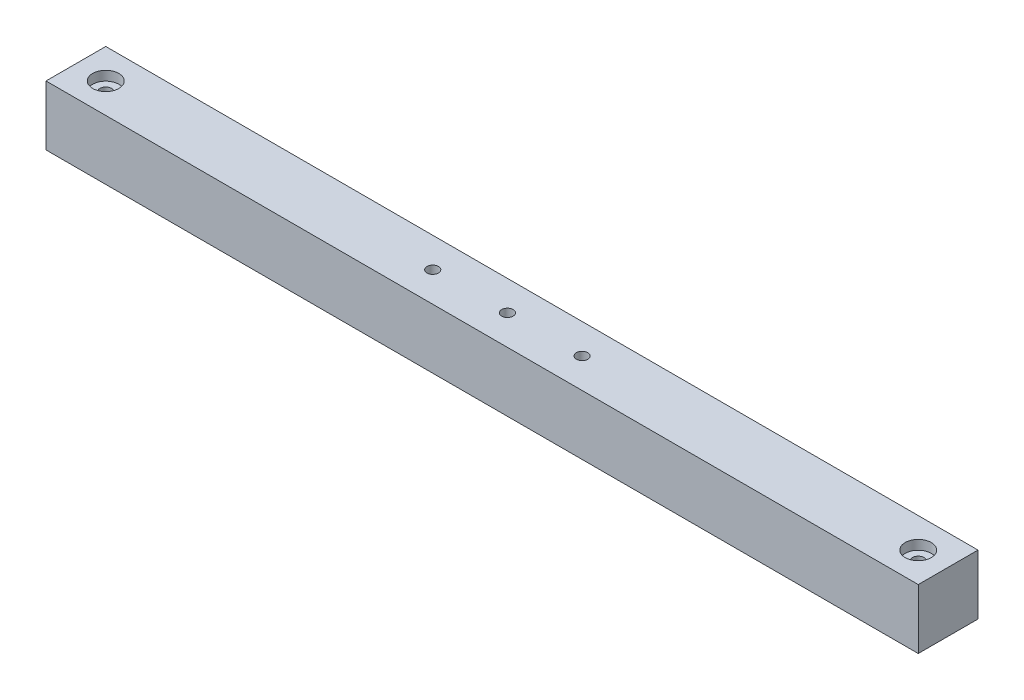
ISO-10303-21;
HEADER;
FILE_DESCRIPTION(('STEP AP214'),'2;1');
FILE_NAME('part.step','',(''),(''),'','','');
FILE_SCHEMA(('AUTOMOTIVE_DESIGN { 1 0 10303 214 1 1 1 1 }'));
ENDSEC;
DATA;
#1=APPLICATION_CONTEXT('core data for automotive mechanical design processes');
#2=APPLICATION_PROTOCOL_DEFINITION('international standard','automotive_design',2000,#1);
#3=PRODUCT_CONTEXT('',#1,'mechanical');
#4=PRODUCT('Part','Part','',(#3));
#5=PRODUCT_RELATED_PRODUCT_CATEGORY('part','',(#4));
#6=PRODUCT_DEFINITION_FORMATION('','',#4);
#7=PRODUCT_DEFINITION_CONTEXT('part definition',#1,'design');
#8=PRODUCT_DEFINITION('design','',#6,#7);
#9=PRODUCT_DEFINITION_SHAPE('','',#8);
#10=(LENGTH_UNIT() NAMED_UNIT(*) SI_UNIT(.MILLI.,.METRE.));
#11=(NAMED_UNIT(*) PLANE_ANGLE_UNIT() SI_UNIT($,.RADIAN.));
#12=(NAMED_UNIT(*) SI_UNIT($,.STERADIAN.) SOLID_ANGLE_UNIT());
#13=UNCERTAINTY_MEASURE_WITH_UNIT(LENGTH_MEASURE(1.E-05),#10,'distance_accuracy_value','');
#14=(GEOMETRIC_REPRESENTATION_CONTEXT(3) GLOBAL_UNCERTAINTY_ASSIGNED_CONTEXT((#13)) GLOBAL_UNIT_ASSIGNED_CONTEXT((#10,
#11,#12)) REPRESENTATION_CONTEXT('',''));
#15=CARTESIAN_POINT('',(0.,0.,0.));
#16=DIRECTION('',(0.,0.,1.));
#17=DIRECTION('',(1.,0.,0.));
#18=AXIS2_PLACEMENT_3D('',#15,#16,#17);
#19=CARTESIAN_POINT('',(0.,12.7,0.));
#20=DIRECTION('',(1.,0.,0.));
#21=DIRECTION('',(0.,0.,-1.));
#22=AXIS2_PLACEMENT_3D('',#19,#20,#21);
#23=PLANE('',#22);
#24=DIRECTION('',(0.,0.,1.));
#25=VECTOR('',#24,1.);
#26=CARTESIAN_POINT('',(0.,0.,0.));
#27=LINE('',#26,#25);
#28=CARTESIAN_POINT('',(0.,0.,-12.7));
#29=VERTEX_POINT('',#28);
#30=CARTESIAN_POINT('',(0.,0.,0.));
#31=VERTEX_POINT('',#30);
#32=EDGE_CURVE('E103',#29,#31,#27,.T.);
#33=ORIENTED_EDGE('',*,*,#32,.T.);
#34=DIRECTION('',(0.,-1.,0.));
#35=VECTOR('',#34,1.);
#36=CARTESIAN_POINT('',(0.,12.7,0.));
#37=LINE('',#36,#35);
#38=CARTESIAN_POINT('',(0.,12.7,0.));
#39=VERTEX_POINT('',#38);
#40=EDGE_CURVE('E11',#39,#31,#37,.T.);
#41=ORIENTED_EDGE('',*,*,#40,.F.);
#42=DIRECTION('',(0.,0.,1.));
#43=VECTOR('',#42,1.);
#44=CARTESIAN_POINT('',(0.,12.7,0.));
#45=LINE('',#44,#43);
#46=CARTESIAN_POINT('',(0.,12.7,-12.7));
#47=VERTEX_POINT('',#46);
#48=EDGE_CURVE('E90',#47,#39,#45,.T.);
#49=ORIENTED_EDGE('',*,*,#48,.F.);
#50=DIRECTION('',(0.,-1.,0.));
#51=VECTOR('',#50,1.);
#52=CARTESIAN_POINT('',(0.,12.7,-12.7));
#53=LINE('',#52,#51);
#54=EDGE_CURVE('E99',#47,#29,#53,.T.);
#55=ORIENTED_EDGE('',*,*,#54,.T.);
#56=EDGE_LOOP('',(#33,#41,#49,#55));
#57=FACE_BOUND('',#56,.T.);
#58=ADVANCED_FACE('F37',(#57),#23,.F.);
#59=CARTESIAN_POINT('',(0.,12.7,0.));
#60=DIRECTION('',(0.,0.,-1.));
#61=DIRECTION('',(-1.,0.,0.));
#62=AXIS2_PLACEMENT_3D('',#59,#60,#61);
#63=PLANE('',#62);
#64=DIRECTION('',(1.,0.,0.));
#65=VECTOR('',#64,1.);
#66=CARTESIAN_POINT('',(0.,0.,0.));
#67=LINE('',#66,#65);
#68=CARTESIAN_POINT('',(185.39968,0.,0.));
#69=VERTEX_POINT('',#68);
#70=EDGE_CURVE('E94',#31,#69,#67,.T.);
#71=ORIENTED_EDGE('',*,*,#70,.T.);
#72=DIRECTION('',(0.,-1.,0.));
#73=VECTOR('',#72,1.);
#74=CARTESIAN_POINT('',(185.39968,12.7,0.));
#75=LINE('',#74,#73);
#76=CARTESIAN_POINT('',(185.39968,12.7,0.));
#77=VERTEX_POINT('',#76);
#78=EDGE_CURVE('E46',#77,#69,#75,.T.);
#79=ORIENTED_EDGE('',*,*,#78,.F.);
#80=DIRECTION('',(1.,0.,0.));
#81=VECTOR('',#80,1.);
#82=CARTESIAN_POINT('',(0.,12.7,0.));
#83=LINE('',#82,#81);
#84=EDGE_CURVE('E85',#39,#77,#83,.T.);
#85=ORIENTED_EDGE('',*,*,#84,.F.);
#86=ORIENTED_EDGE('',*,*,#40,.T.);
#87=EDGE_LOOP('',(#71,#79,#85,#86));
#88=FACE_BOUND('',#87,.T.);
#89=ADVANCED_FACE('F93',(#88),#63,.F.);
#90=CARTESIAN_POINT('',(185.39968,12.7,0.));
#91=DIRECTION('',(-1.,0.,0.));
#92=DIRECTION('',(0.,0.,1.));
#93=AXIS2_PLACEMENT_3D('',#90,#91,#92);
#94=PLANE('',#93);
#95=DIRECTION('',(0.,0.,-1.));
#96=VECTOR('',#95,1.);
#97=CARTESIAN_POINT('',(185.39968,0.,0.));
#98=LINE('',#97,#96);
#99=CARTESIAN_POINT('',(185.39968,0.,-12.7));
#100=VERTEX_POINT('',#99);
#101=EDGE_CURVE('E72',#69,#100,#98,.T.);
#102=ORIENTED_EDGE('',*,*,#101,.T.);
#103=DIRECTION('',(0.,-1.,0.));
#104=VECTOR('',#103,1.);
#105=CARTESIAN_POINT('',(185.39968,12.7,-12.7));
#106=LINE('',#105,#104);
#107=CARTESIAN_POINT('',(185.39968,12.7,-12.7));
#108=VERTEX_POINT('',#107);
#109=EDGE_CURVE('E95',#108,#100,#106,.T.);
#110=ORIENTED_EDGE('',*,*,#109,.F.);
#111=DIRECTION('',(0.,0.,-1.));
#112=VECTOR('',#111,1.);
#113=CARTESIAN_POINT('',(185.39968,12.7,0.));
#114=LINE('',#113,#112);
#115=EDGE_CURVE('E88',#77,#108,#114,.T.);
#116=ORIENTED_EDGE('',*,*,#115,.F.);
#117=ORIENTED_EDGE('',*,*,#78,.T.);
#118=EDGE_LOOP('',(#102,#110,#116,#117));
#119=FACE_BOUND('',#118,.T.);
#120=ADVANCED_FACE('F97',(#119),#94,.F.);
#121=CARTESIAN_POINT('',(0.,12.7,-12.7));
#122=DIRECTION('',(0.,0.,1.));
#123=DIRECTION('',(1.,0.,0.));
#124=AXIS2_PLACEMENT_3D('',#121,#122,#123);
#125=PLANE('',#124);
#126=DIRECTION('',(-1.,0.,0.));
#127=VECTOR('',#126,1.);
#128=CARTESIAN_POINT('',(0.,0.,-12.7));
#129=LINE('',#128,#127);
#130=EDGE_CURVE('E78',#100,#29,#129,.T.);
#131=ORIENTED_EDGE('',*,*,#130,.T.);
#132=ORIENTED_EDGE('',*,*,#54,.F.);
#133=DIRECTION('',(-1.,0.,0.));
#134=VECTOR('',#133,1.);
#135=CARTESIAN_POINT('',(0.,12.7,-12.7));
#136=LINE('',#135,#134);
#137=EDGE_CURVE('E55',#108,#47,#136,.T.);
#138=ORIENTED_EDGE('',*,*,#137,.F.);
#139=ORIENTED_EDGE('',*,*,#109,.T.);
#140=EDGE_LOOP('',(#131,#132,#138,#139));
#141=FACE_BOUND('',#140,.T.);
#142=ADVANCED_FACE('F150',(#141),#125,.F.);
#143=CARTESIAN_POINT('',(0.,12.7,0.));
#144=DIRECTION('',(0.,-1.,0.));
#145=DIRECTION('',(0.,0.,-1.));
#146=AXIS2_PLACEMENT_3D('',#143,#144,#145);
#147=PLANE('',#146);
#148=CARTESIAN_POINT('',(75.8444,12.7,-6.35000000000001));
#149=DIRECTION('',(0.,1.,0.));
#150=DIRECTION('',(0.,0.,1.));
#151=AXIS2_PLACEMENT_3D('',#148,#149,#150);
#152=CIRCLE('',#151,1.2192);
#153=CARTESIAN_POINT('',(75.8444,12.7,-5.13080000000001));
#154=VERTEX_POINT('',#153);
#155=EDGE_CURVE('E318',#154,#154,#152,.T.);
#156=ORIENTED_EDGE('',*,*,#155,.F.);
#157=EDGE_LOOP('',(#156));
#158=FACE_BOUND('',#157,.T.);
#159=CARTESIAN_POINT('',(91.7194,12.7,-6.34999999999999));
#160=DIRECTION('',(0.,1.,0.));
#161=DIRECTION('',(0.,0.,1.));
#162=AXIS2_PLACEMENT_3D('',#159,#160,#161);
#163=CIRCLE('',#162,1.2192);
#164=CARTESIAN_POINT('',(91.7194,12.7,-5.13079999999999));
#165=VERTEX_POINT('',#164);
#166=EDGE_CURVE('E319',#165,#165,#163,.T.);
#167=ORIENTED_EDGE('',*,*,#166,.F.);
#168=EDGE_LOOP('',(#167));
#169=FACE_BOUND('',#168,.T.);
#170=CARTESIAN_POINT('',(107.5944,12.7,-6.34999999999999));
#171=DIRECTION('',(0.,1.,0.));
#172=DIRECTION('',(0.,0.,1.));
#173=AXIS2_PLACEMENT_3D('',#170,#171,#172);
#174=CIRCLE('',#173,1.2192);
#175=CARTESIAN_POINT('',(107.5944,12.7,-5.13079999999999));
#176=VERTEX_POINT('',#175);
#177=EDGE_CURVE('E327',#176,#176,#174,.T.);
#178=ORIENTED_EDGE('',*,*,#177,.F.);
#179=EDGE_LOOP('',(#178));
#180=FACE_BOUND('',#179,.T.);
#181=CARTESIAN_POINT('',(179.04968,12.7,-6.35));
#182=DIRECTION('',(0.,-1.,0.));
#183=DIRECTION('',(0.,0.,-1.));
#184=AXIS2_PLACEMENT_3D('',#181,#182,#183);
#185=CIRCLE('',#184,2.77494999999999);
#186=CARTESIAN_POINT('',(179.04968,12.7,-9.12495));
#187=VERTEX_POINT('',#186);
#188=EDGE_CURVE('E119',#187,#187,#185,.T.);
#189=ORIENTED_EDGE('',*,*,#188,.T.);
#190=EDGE_LOOP('',(#189));
#191=FACE_BOUND('',#190,.T.);
#192=CARTESIAN_POINT('',(6.35,12.7,-6.35));
#193=DIRECTION('',(0.,-1.,0.));
#194=DIRECTION('',(0.,0.,-1.));
#195=AXIS2_PLACEMENT_3D('',#192,#193,#194);
#196=CIRCLE('',#195,2.77495);
#197=CARTESIAN_POINT('',(6.35,12.7,-9.12495));
#198=VERTEX_POINT('',#197);
#199=EDGE_CURVE('E124',#198,#198,#196,.T.);
#200=ORIENTED_EDGE('',*,*,#199,.T.);
#201=EDGE_LOOP('',(#200));
#202=FACE_BOUND('',#201,.T.);
#203=ORIENTED_EDGE('',*,*,#48,.T.);
#204=ORIENTED_EDGE('',*,*,#84,.T.);
#205=ORIENTED_EDGE('',*,*,#115,.T.);
#206=ORIENTED_EDGE('',*,*,#137,.T.);
#207=EDGE_LOOP('',(#203,#204,#205,#206));
#208=FACE_BOUND('',#207,.T.);
#209=ADVANCED_FACE('F86',(#158,#169,#180,#191,#202,#208),#147,.F.);
#210=CARTESIAN_POINT('',(0.,0.,0.));
#211=DIRECTION('',(0.,-1.,0.));
#212=DIRECTION('',(0.,0.,-1.));
#213=AXIS2_PLACEMENT_3D('',#210,#211,#212);
#214=PLANE('',#213);
#215=CARTESIAN_POINT('',(75.8444,0.,-6.35000000000001));
#216=DIRECTION('',(0.,1.,0.));
#217=DIRECTION('',(0.,0.,1.));
#218=AXIS2_PLACEMENT_3D('',#215,#216,#217);
#219=CIRCLE('',#218,1.2192);
#220=CARTESIAN_POINT('',(75.8444,0.,-5.13080000000001));
#221=VERTEX_POINT('',#220);
#222=EDGE_CURVE('E135',#221,#221,#219,.T.);
#223=ORIENTED_EDGE('',*,*,#222,.T.);
#224=EDGE_LOOP('',(#223));
#225=FACE_BOUND('',#224,.T.);
#226=CARTESIAN_POINT('',(91.7194,0.,-6.34999999999999));
#227=DIRECTION('',(0.,1.,0.));
#228=DIRECTION('',(0.,0.,1.));
#229=AXIS2_PLACEMENT_3D('',#226,#227,#228);
#230=CIRCLE('',#229,1.2192);
#231=CARTESIAN_POINT('',(91.7194,0.,-5.13079999999999));
#232=VERTEX_POINT('',#231);
#233=EDGE_CURVE('E323',#232,#232,#230,.T.);
#234=ORIENTED_EDGE('',*,*,#233,.T.);
#235=EDGE_LOOP('',(#234));
#236=FACE_BOUND('',#235,.T.);
#237=CARTESIAN_POINT('',(107.5944,0.,-6.34999999999999));
#238=DIRECTION('',(0.,1.,0.));
#239=DIRECTION('',(0.,0.,1.));
#240=AXIS2_PLACEMENT_3D('',#237,#238,#239);
#241=CIRCLE('',#240,1.2192);
#242=CARTESIAN_POINT('',(107.5944,0.,-5.13079999999999));
#243=VERTEX_POINT('',#242);
#244=EDGE_CURVE('E127',#243,#243,#241,.T.);
#245=ORIENTED_EDGE('',*,*,#244,.T.);
#246=EDGE_LOOP('',(#245));
#247=FACE_BOUND('',#246,.T.);
#248=CARTESIAN_POINT('',(179.04968,0.,-6.35));
#249=DIRECTION('',(0.,-1.,0.));
#250=DIRECTION('',(0.,0.,-1.));
#251=AXIS2_PLACEMENT_3D('',#248,#249,#250);
#252=CIRCLE('',#251,1.25000000000001);
#253=CARTESIAN_POINT('',(179.04968,0.,-7.60000000000001));
#254=VERTEX_POINT('',#253);
#255=EDGE_CURVE('E106',#254,#254,#252,.T.);
#256=ORIENTED_EDGE('',*,*,#255,.F.);
#257=EDGE_LOOP('',(#256));
#258=FACE_BOUND('',#257,.T.);
#259=CARTESIAN_POINT('',(6.35,0.,-6.35));
#260=DIRECTION('',(0.,-1.,0.));
#261=DIRECTION('',(0.,0.,-1.));
#262=AXIS2_PLACEMENT_3D('',#259,#260,#261);
#263=CIRCLE('',#262,1.25);
#264=CARTESIAN_POINT('',(6.35,0.,-7.6));
#265=VERTEX_POINT('',#264);
#266=EDGE_CURVE('E117',#265,#265,#263,.T.);
#267=ORIENTED_EDGE('',*,*,#266,.F.);
#268=EDGE_LOOP('',(#267));
#269=FACE_BOUND('',#268,.T.);
#270=ORIENTED_EDGE('',*,*,#32,.F.);
#271=ORIENTED_EDGE('',*,*,#130,.F.);
#272=ORIENTED_EDGE('',*,*,#101,.F.);
#273=ORIENTED_EDGE('',*,*,#70,.F.);
#274=EDGE_LOOP('',(#270,#271,#272,#273));
#275=FACE_BOUND('',#274,.T.);
#276=ADVANCED_FACE('F143',(#225,#236,#247,#258,#269,#275),#214,.T.);
#277=CARTESIAN_POINT('',(6.35,12.7,-6.35));
#278=DIRECTION('',(0.,-1.,0.));
#279=DIRECTION('',(0.,0.,-1.));
#280=AXIS2_PLACEMENT_3D('',#277,#278,#279);
#281=CYLINDRICAL_SURFACE('',#280,1.25);
#282=CARTESIAN_POINT('',(6.35,10.70102,-6.35));
#283=DIRECTION('',(0.,-1.,0.));
#284=DIRECTION('',(0.,0.,-1.));
#285=AXIS2_PLACEMENT_3D('',#282,#283,#284);
#286=CIRCLE('',#285,1.25);
#287=CARTESIAN_POINT('',(6.35,10.70102,-7.6));
#288=VERTEX_POINT('',#287);
#289=EDGE_CURVE('E40',#288,#288,#286,.F.);
#290=ORIENTED_EDGE('',*,*,#289,.T.);
#291=EDGE_LOOP('',(#290));
#292=FACE_BOUND('',#291,.T.);
#293=ORIENTED_EDGE('',*,*,#266,.T.);
#294=EDGE_LOOP('',(#293));
#295=FACE_BOUND('',#294,.T.);
#296=ADVANCED_FACE('F141',(#292,#295),#281,.F.);
#297=CARTESIAN_POINT('',(179.04968,12.7,-6.35));
#298=DIRECTION('',(0.,-1.,0.));
#299=DIRECTION('',(0.,0.,-1.));
#300=AXIS2_PLACEMENT_3D('',#297,#298,#299);
#301=CYLINDRICAL_SURFACE('',#300,1.25000000000001);
#302=CARTESIAN_POINT('',(179.04968,10.70102,-6.35));
#303=DIRECTION('',(0.,-1.,0.));
#304=DIRECTION('',(0.,0.,-1.));
#305=AXIS2_PLACEMENT_3D('',#302,#303,#304);
#306=CIRCLE('',#305,1.25000000000001);
#307=CARTESIAN_POINT('',(179.04968,10.70102,-7.60000000000001));
#308=VERTEX_POINT('',#307);
#309=EDGE_CURVE('E111',#308,#308,#306,.F.);
#310=ORIENTED_EDGE('',*,*,#309,.T.);
#311=EDGE_LOOP('',(#310));
#312=FACE_BOUND('',#311,.T.);
#313=ORIENTED_EDGE('',*,*,#255,.T.);
#314=EDGE_LOOP('',(#313));
#315=FACE_BOUND('',#314,.T.);
#316=ADVANCED_FACE('F187',(#312,#315),#301,.F.);
#317=CARTESIAN_POINT('',(179.04968,10.70102,-6.35));
#318=DIRECTION('',(0.,-1.,0.));
#319=DIRECTION('',(0.,0.,-1.));
#320=AXIS2_PLACEMENT_3D('',#317,#318,#319);
#321=PLANE('',#320);
#322=CARTESIAN_POINT('',(179.04968,10.70102,-6.35));
#323=DIRECTION('',(0.,-1.,0.));
#324=DIRECTION('',(0.,0.,-1.));
#325=AXIS2_PLACEMENT_3D('',#322,#323,#324);
#326=CIRCLE('',#325,2.77494999999999);
#327=CARTESIAN_POINT('',(179.04968,10.70102,-9.12495));
#328=VERTEX_POINT('',#327);
#329=EDGE_CURVE('E113',#328,#328,#326,.T.);
#330=ORIENTED_EDGE('',*,*,#329,.F.);
#331=EDGE_LOOP('',(#330));
#332=FACE_BOUND('',#331,.T.);
#333=ORIENTED_EDGE('',*,*,#309,.F.);
#334=EDGE_LOOP('',(#333));
#335=FACE_BOUND('',#334,.T.);
#336=ADVANCED_FACE('F200',(#332,#335),#321,.F.);
#337=CARTESIAN_POINT('',(179.04968,10.70102,-6.35));
#338=DIRECTION('',(0.,1.,0.));
#339=DIRECTION('',(0.,0.,1.));
#340=AXIS2_PLACEMENT_3D('',#337,#338,#339);
#341=CYLINDRICAL_SURFACE('',#340,2.77494999999999);
#342=ORIENTED_EDGE('',*,*,#329,.T.);
#343=EDGE_LOOP('',(#342));
#344=FACE_BOUND('',#343,.T.);
#345=ORIENTED_EDGE('',*,*,#188,.F.);
#346=EDGE_LOOP('',(#345));
#347=FACE_BOUND('',#346,.T.);
#348=ADVANCED_FACE('F210',(#344,#347),#341,.F.);
#349=CARTESIAN_POINT('',(6.35,10.70102,-6.35));
#350=DIRECTION('',(0.,-1.,0.));
#351=DIRECTION('',(0.,0.,-1.));
#352=AXIS2_PLACEMENT_3D('',#349,#350,#351);
#353=PLANE('',#352);
#354=CARTESIAN_POINT('',(6.35,10.70102,-6.35));
#355=DIRECTION('',(0.,-1.,0.));
#356=DIRECTION('',(0.,0.,-1.));
#357=AXIS2_PLACEMENT_3D('',#354,#355,#356);
#358=CIRCLE('',#357,2.77495);
#359=CARTESIAN_POINT('',(6.35,10.70102,-9.12495));
#360=VERTEX_POINT('',#359);
#361=EDGE_CURVE('E132',#360,#360,#358,.T.);
#362=ORIENTED_EDGE('',*,*,#361,.F.);
#363=EDGE_LOOP('',(#362));
#364=FACE_BOUND('',#363,.T.);
#365=ORIENTED_EDGE('',*,*,#289,.F.);
#366=EDGE_LOOP('',(#365));
#367=FACE_BOUND('',#366,.T.);
#368=ADVANCED_FACE('F221',(#364,#367),#353,.F.);
#369=CARTESIAN_POINT('',(6.35,10.70102,-6.35));
#370=DIRECTION('',(0.,1.,0.));
#371=DIRECTION('',(0.,0.,1.));
#372=AXIS2_PLACEMENT_3D('',#369,#370,#371);
#373=CYLINDRICAL_SURFACE('',#372,2.77495);
#374=ORIENTED_EDGE('',*,*,#361,.T.);
#375=EDGE_LOOP('',(#374));
#376=FACE_BOUND('',#375,.T.);
#377=ORIENTED_EDGE('',*,*,#199,.F.);
#378=EDGE_LOOP('',(#377));
#379=FACE_BOUND('',#378,.T.);
#380=ADVANCED_FACE('F231',(#376,#379),#373,.F.);
#381=CARTESIAN_POINT('',(107.5944,0.,-6.34999999999999));
#382=DIRECTION('',(0.,1.,0.));
#383=DIRECTION('',(0.,0.,1.));
#384=AXIS2_PLACEMENT_3D('',#381,#382,#383);
#385=CYLINDRICAL_SURFACE('',#384,1.2192);
#386=ORIENTED_EDGE('',*,*,#244,.F.);
#387=EDGE_LOOP('',(#386));
#388=FACE_BOUND('',#387,.T.);
#389=ORIENTED_EDGE('',*,*,#177,.T.);
#390=EDGE_LOOP('',(#389));
#391=FACE_BOUND('',#390,.T.);
#392=ADVANCED_FACE('F241',(#388,#391),#385,.F.);
#393=CARTESIAN_POINT('',(91.7194,0.,-6.34999999999999));
#394=DIRECTION('',(0.,1.,0.));
#395=DIRECTION('',(0.,0.,1.));
#396=AXIS2_PLACEMENT_3D('',#393,#394,#395);
#397=CYLINDRICAL_SURFACE('',#396,1.2192);
#398=ORIENTED_EDGE('',*,*,#233,.F.);
#399=EDGE_LOOP('',(#398));
#400=FACE_BOUND('',#399,.T.);
#401=ORIENTED_EDGE('',*,*,#166,.T.);
#402=EDGE_LOOP('',(#401));
#403=FACE_BOUND('',#402,.T.);
#404=ADVANCED_FACE('F257',(#400,#403),#397,.F.);
#405=CARTESIAN_POINT('',(75.8444,0.,-6.35000000000001));
#406=DIRECTION('',(0.,1.,0.));
#407=DIRECTION('',(0.,0.,1.));
#408=AXIS2_PLACEMENT_3D('',#405,#406,#407);
#409=CYLINDRICAL_SURFACE('',#408,1.2192);
#410=ORIENTED_EDGE('',*,*,#222,.F.);
#411=EDGE_LOOP('',(#410));
#412=FACE_BOUND('',#411,.T.);
#413=ORIENTED_EDGE('',*,*,#155,.T.);
#414=EDGE_LOOP('',(#413));
#415=FACE_BOUND('',#414,.T.);
#416=ADVANCED_FACE('F268',(#412,#415),#409,.F.);
#417=CLOSED_SHELL('',(#58,#89,#120,#142,#209,#276,#296,#316,#336,#348,#368,#380,#392,#404,#416));
#418=MANIFOLD_SOLID_BREP('B2',#417);
#419=ADVANCED_BREP_SHAPE_REPRESENTATION('',(#18,#418),#14);
#420=SHAPE_DEFINITION_REPRESENTATION(#9,#419);
ENDSEC;
END-ISO-10303-21;
